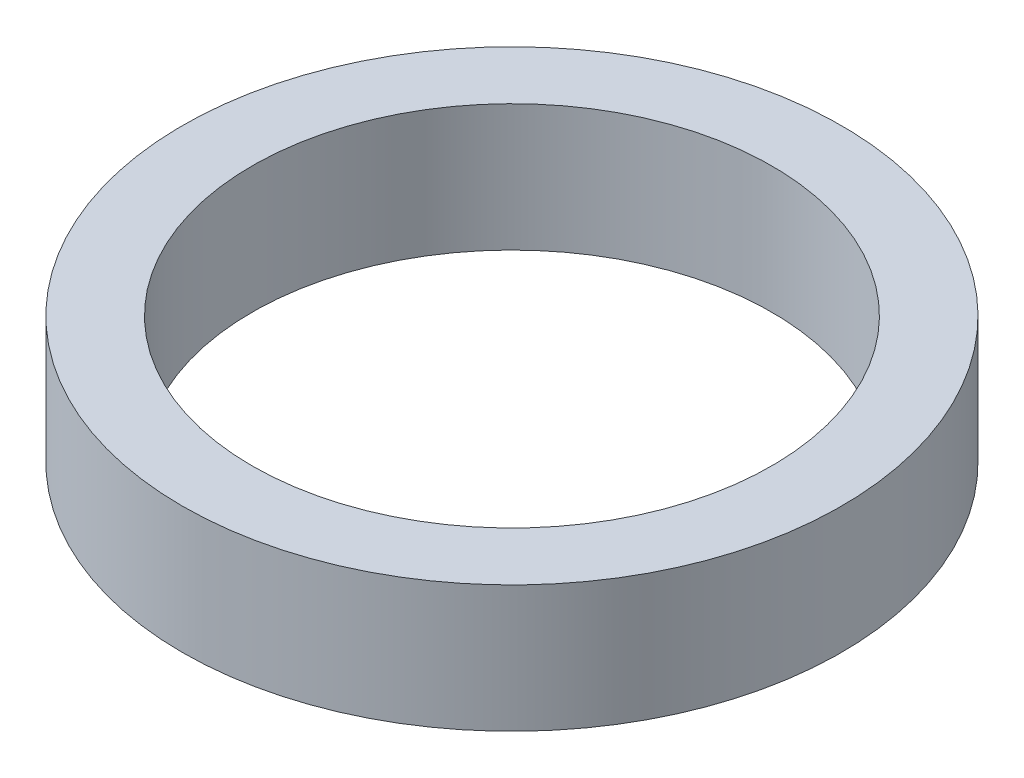
ISO-10303-21;
HEADER;
FILE_DESCRIPTION(('STEP AP214'),'2;1');
FILE_NAME('part.step','',(''),(''),'','','');
FILE_SCHEMA(('AUTOMOTIVE_DESIGN { 1 0 10303 214 1 1 1 1 }'));
ENDSEC;
DATA;
#1=APPLICATION_CONTEXT('core data for automotive mechanical design processes');
#2=APPLICATION_PROTOCOL_DEFINITION('international standard','automotive_design',2000,#1);
#3=PRODUCT_CONTEXT('',#1,'mechanical');
#4=PRODUCT('Part','Part','',(#3));
#5=PRODUCT_RELATED_PRODUCT_CATEGORY('part','',(#4));
#6=PRODUCT_DEFINITION_FORMATION('','',#4);
#7=PRODUCT_DEFINITION_CONTEXT('part definition',#1,'design');
#8=PRODUCT_DEFINITION('design','',#6,#7);
#9=PRODUCT_DEFINITION_SHAPE('','',#8);
#10=(LENGTH_UNIT() NAMED_UNIT(*) SI_UNIT(.MILLI.,.METRE.));
#11=(NAMED_UNIT(*) PLANE_ANGLE_UNIT() SI_UNIT($,.RADIAN.));
#12=(NAMED_UNIT(*) SI_UNIT($,.STERADIAN.) SOLID_ANGLE_UNIT());
#13=UNCERTAINTY_MEASURE_WITH_UNIT(LENGTH_MEASURE(1.E-05),#10,'distance_accuracy_value','');
#14=(GEOMETRIC_REPRESENTATION_CONTEXT(3) GLOBAL_UNCERTAINTY_ASSIGNED_CONTEXT((#13)) GLOBAL_UNIT_ASSIGNED_CONTEXT((#10,
#11,#12)) REPRESENTATION_CONTEXT('',''));
#15=CARTESIAN_POINT('',(0.,0.,0.));
#16=DIRECTION('',(0.,0.,1.));
#17=DIRECTION('',(1.,0.,0.));
#18=AXIS2_PLACEMENT_3D('',#15,#16,#17);
#19=CARTESIAN_POINT('',(0.,1.,0.));
#20=DIRECTION('',(0.,1.,0.));
#21=DIRECTION('',(0.,0.,1.));
#22=AXIS2_PLACEMENT_3D('',#19,#20,#21);
#23=PLANE('',#22);
#24=CARTESIAN_POINT('',(0.,1.,0.));
#25=DIRECTION('',(0.,1.,0.));
#26=DIRECTION('',(0.,0.,1.));
#27=AXIS2_PLACEMENT_3D('',#24,#25,#26);
#28=CIRCLE('',#27,2.6);
#29=CARTESIAN_POINT('',(0.,1.,2.6));
#30=VERTEX_POINT('',#29);
#31=EDGE_CURVE('E10',#30,#30,#28,.T.);
#32=ORIENTED_EDGE('',*,*,#31,.T.);
#33=EDGE_LOOP('',(#32));
#34=FACE_BOUND('',#33,.T.);
#35=CARTESIAN_POINT('',(0.,1.,0.));
#36=DIRECTION('',(0.,1.,0.));
#37=DIRECTION('',(0.,0.,1.));
#38=AXIS2_PLACEMENT_3D('',#35,#36,#37);
#39=CIRCLE('',#38,2.05);
#40=CARTESIAN_POINT('',(0.,1.,2.05));
#41=VERTEX_POINT('',#40);
#42=EDGE_CURVE('E50',#41,#41,#39,.T.);
#43=ORIENTED_EDGE('',*,*,#42,.F.);
#44=EDGE_LOOP('',(#43));
#45=FACE_BOUND('',#44,.T.);
#46=ADVANCED_FACE('F37',(#34,#45),#23,.T.);
#47=CARTESIAN_POINT('',(0.,0.,0.));
#48=DIRECTION('',(0.,1.,0.));
#49=DIRECTION('',(0.,0.,1.));
#50=AXIS2_PLACEMENT_3D('',#47,#48,#49);
#51=PLANE('',#50);
#52=CARTESIAN_POINT('',(0.,0.,0.));
#53=DIRECTION('',(0.,1.,0.));
#54=DIRECTION('',(0.,0.,1.));
#55=AXIS2_PLACEMENT_3D('',#52,#53,#54);
#56=CIRCLE('',#55,2.6);
#57=CARTESIAN_POINT('',(0.,0.,2.6));
#58=VERTEX_POINT('',#57);
#59=EDGE_CURVE('E41',#58,#58,#56,.T.);
#60=ORIENTED_EDGE('',*,*,#59,.F.);
#61=EDGE_LOOP('',(#60));
#62=FACE_BOUND('',#61,.T.);
#63=CARTESIAN_POINT('',(0.,0.,0.));
#64=DIRECTION('',(0.,1.,0.));
#65=DIRECTION('',(0.,0.,1.));
#66=AXIS2_PLACEMENT_3D('',#63,#64,#65);
#67=CIRCLE('',#66,2.05);
#68=CARTESIAN_POINT('',(0.,0.,2.05));
#69=VERTEX_POINT('',#68);
#70=EDGE_CURVE('E52',#69,#69,#67,.T.);
#71=ORIENTED_EDGE('',*,*,#70,.T.);
#72=EDGE_LOOP('',(#71));
#73=FACE_BOUND('',#72,.T.);
#74=ADVANCED_FACE('F64',(#62,#73),#51,.F.);
#75=CARTESIAN_POINT('',(0.,1.,0.));
#76=DIRECTION('',(0.,-1.,0.));
#77=DIRECTION('',(0.,0.,-1.));
#78=AXIS2_PLACEMENT_3D('',#75,#76,#77);
#79=CYLINDRICAL_SURFACE('',#78,2.6);
#80=ORIENTED_EDGE('',*,*,#31,.F.);
#81=EDGE_LOOP('',(#80));
#82=FACE_BOUND('',#81,.T.);
#83=ORIENTED_EDGE('',*,*,#59,.T.);
#84=EDGE_LOOP('',(#83));
#85=FACE_BOUND('',#84,.T.);
#86=ADVANCED_FACE('F39',(#82,#85),#79,.T.);
#87=CARTESIAN_POINT('',(0.,1.,0.));
#88=DIRECTION('',(0.,-1.,0.));
#89=DIRECTION('',(0.,0.,-1.));
#90=AXIS2_PLACEMENT_3D('',#87,#88,#89);
#91=CYLINDRICAL_SURFACE('',#90,2.05);
#92=ORIENTED_EDGE('',*,*,#42,.T.);
#93=EDGE_LOOP('',(#92));
#94=FACE_BOUND('',#93,.T.);
#95=ORIENTED_EDGE('',*,*,#70,.F.);
#96=EDGE_LOOP('',(#95));
#97=FACE_BOUND('',#96,.T.);
#98=ADVANCED_FACE('F60',(#94,#97),#91,.F.);
#99=CLOSED_SHELL('',(#46,#74,#86,#98));
#100=MANIFOLD_SOLID_BREP('B2',#99);
#101=ADVANCED_BREP_SHAPE_REPRESENTATION('',(#18,#100),#14);
#102=SHAPE_DEFINITION_REPRESENTATION(#9,#101);
ENDSEC;
END-ISO-10303-21;
